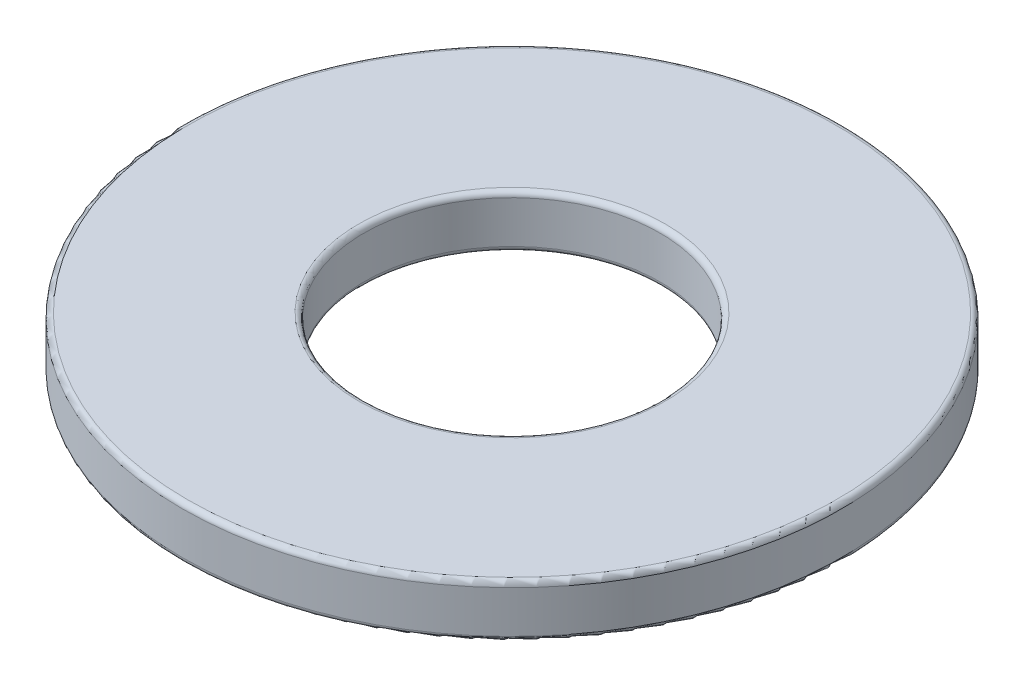
ISO-10303-21;
HEADER;
FILE_DESCRIPTION(('STEP AP214'),'2;1');
FILE_NAME('part.step','',(''),(''),'','','');
FILE_SCHEMA(('AUTOMOTIVE_DESIGN { 1 0 10303 214 1 1 1 1 }'));
ENDSEC;
DATA;
#1=APPLICATION_CONTEXT('core data for automotive mechanical design processes');
#2=APPLICATION_PROTOCOL_DEFINITION('international standard','automotive_design',2000,#1);
#3=PRODUCT_CONTEXT('',#1,'mechanical');
#4=PRODUCT('Part','Part','',(#3));
#5=PRODUCT_RELATED_PRODUCT_CATEGORY('part','',(#4));
#6=PRODUCT_DEFINITION_FORMATION('','',#4);
#7=PRODUCT_DEFINITION_CONTEXT('part definition',#1,'design');
#8=PRODUCT_DEFINITION('design','',#6,#7);
#9=PRODUCT_DEFINITION_SHAPE('','',#8);
#10=(LENGTH_UNIT() NAMED_UNIT(*) SI_UNIT(.MILLI.,.METRE.));
#11=(NAMED_UNIT(*) PLANE_ANGLE_UNIT() SI_UNIT($,.RADIAN.));
#12=(NAMED_UNIT(*) SI_UNIT($,.STERADIAN.) SOLID_ANGLE_UNIT());
#13=UNCERTAINTY_MEASURE_WITH_UNIT(LENGTH_MEASURE(1.E-05),#10,'distance_accuracy_value','');
#14=(GEOMETRIC_REPRESENTATION_CONTEXT(3) GLOBAL_UNCERTAINTY_ASSIGNED_CONTEXT((#13)) GLOBAL_UNIT_ASSIGNED_CONTEXT((#10,
#11,#12)) REPRESENTATION_CONTEXT('',''));
#15=CARTESIAN_POINT('',(0.,0.,0.));
#16=DIRECTION('',(0.,0.,1.));
#17=DIRECTION('',(1.,0.,0.));
#18=AXIS2_PLACEMENT_3D('',#15,#16,#17);
#19=CARTESIAN_POINT('',(0.,1.27,0.));
#20=DIRECTION('',(0.,1.,0.));
#21=DIRECTION('',(0.,0.,1.));
#22=AXIS2_PLACEMENT_3D('',#19,#20,#21);
#23=PLANE('',#22);
#24=CARTESIAN_POINT('',(0.,1.27,0.));
#25=DIRECTION('',(0.,1.,0.));
#26=DIRECTION('',(0.,0.,1.));
#27=AXIS2_PLACEMENT_3D('',#24,#25,#26);
#28=CIRCLE('',#27,3.6957);
#29=CARTESIAN_POINT('',(0.,1.27,3.6957));
#30=VERTEX_POINT('',#29);
#31=EDGE_CURVE('E10',#30,#30,#28,.F.);
#32=ORIENTED_EDGE('',*,*,#31,.T.);
#33=EDGE_LOOP('',(#32));
#34=FACE_BOUND('',#33,.T.);
#35=CARTESIAN_POINT('',(0.,1.27,0.));
#36=DIRECTION('',(0.,1.,0.));
#37=DIRECTION('',(0.,0.,1.));
#38=AXIS2_PLACEMENT_3D('',#35,#36,#37);
#39=CIRCLE('',#38,7.8105);
#40=CARTESIAN_POINT('',(0.,1.27,7.8105));
#41=VERTEX_POINT('',#40);
#42=EDGE_CURVE('E42',#41,#41,#39,.T.);
#43=ORIENTED_EDGE('',*,*,#42,.T.);
#44=EDGE_LOOP('',(#43));
#45=FACE_BOUND('',#44,.T.);
#46=ADVANCED_FACE('F35',(#34,#45),#23,.T.);
#47=CARTESIAN_POINT('',(0.,0.,0.));
#48=DIRECTION('',(0.,1.,0.));
#49=DIRECTION('',(0.,0.,1.));
#50=AXIS2_PLACEMENT_3D('',#47,#48,#49);
#51=PLANE('',#50);
#52=CARTESIAN_POINT('',(0.,0.,0.));
#53=DIRECTION('',(0.,1.,0.));
#54=DIRECTION('',(0.,0.,1.));
#55=AXIS2_PLACEMENT_3D('',#52,#53,#54);
#56=CIRCLE('',#55,3.6957);
#57=CARTESIAN_POINT('',(0.,0.,3.6957));
#58=VERTEX_POINT('',#57);
#59=EDGE_CURVE('E61',#58,#58,#56,.T.);
#60=ORIENTED_EDGE('',*,*,#59,.T.);
#61=EDGE_LOOP('',(#60));
#62=FACE_BOUND('',#61,.T.);
#63=CARTESIAN_POINT('',(0.,0.,0.));
#64=DIRECTION('',(0.,1.,0.));
#65=DIRECTION('',(0.,0.,1.));
#66=AXIS2_PLACEMENT_3D('',#63,#64,#65);
#67=CIRCLE('',#66,7.8105);
#68=CARTESIAN_POINT('',(0.,0.,7.8105));
#69=VERTEX_POINT('',#68);
#70=EDGE_CURVE('E64',#69,#69,#67,.F.);
#71=ORIENTED_EDGE('',*,*,#70,.T.);
#72=EDGE_LOOP('',(#71));
#73=FACE_BOUND('',#72,.T.);
#74=ADVANCED_FACE('F68',(#62,#73),#51,.F.);
#75=CARTESIAN_POINT('',(0.,1.27,0.));
#76=DIRECTION('',(0.,-1.,0.));
#77=DIRECTION('',(0.,0.,-1.));
#78=AXIS2_PLACEMENT_3D('',#75,#76,#77);
#79=CYLINDRICAL_SURFACE('',#78,7.9375);
#80=CARTESIAN_POINT('',(0.,0.127,0.));
#81=DIRECTION('',(0.,1.,0.));
#82=DIRECTION('',(0.,0.,1.));
#83=AXIS2_PLACEMENT_3D('',#80,#81,#82);
#84=CIRCLE('',#83,7.9375);
#85=CARTESIAN_POINT('',(0.,0.127,7.9375));
#86=VERTEX_POINT('',#85);
#87=EDGE_CURVE('E46',#86,#86,#84,.T.);
#88=ORIENTED_EDGE('',*,*,#87,.T.);
#89=EDGE_LOOP('',(#88));
#90=FACE_BOUND('',#89,.T.);
#91=CARTESIAN_POINT('',(0.,1.143,0.));
#92=DIRECTION('',(0.,1.,0.));
#93=DIRECTION('',(0.,0.,1.));
#94=AXIS2_PLACEMENT_3D('',#91,#92,#93);
#95=CIRCLE('',#94,7.9375);
#96=CARTESIAN_POINT('',(0.,1.143,7.9375));
#97=VERTEX_POINT('',#96);
#98=EDGE_CURVE('E50',#97,#97,#95,.F.);
#99=ORIENTED_EDGE('',*,*,#98,.T.);
#100=EDGE_LOOP('',(#99));
#101=FACE_BOUND('',#100,.T.);
#102=ADVANCED_FACE('F78',(#90,#101),#79,.T.);
#103=CARTESIAN_POINT('',(0.,1.27,0.));
#104=DIRECTION('',(0.,-1.,0.));
#105=DIRECTION('',(0.,0.,-1.));
#106=AXIS2_PLACEMENT_3D('',#103,#104,#105);
#107=CYLINDRICAL_SURFACE('',#106,3.5687);
#108=CARTESIAN_POINT('',(0.,0.127,0.));
#109=DIRECTION('',(0.,1.,0.));
#110=DIRECTION('',(0.,0.,1.));
#111=AXIS2_PLACEMENT_3D('',#108,#109,#110);
#112=CIRCLE('',#111,3.5687);
#113=CARTESIAN_POINT('',(0.,0.127,3.5687));
#114=VERTEX_POINT('',#113);
#115=EDGE_CURVE('E55',#114,#114,#112,.F.);
#116=ORIENTED_EDGE('',*,*,#115,.T.);
#117=EDGE_LOOP('',(#116));
#118=FACE_BOUND('',#117,.T.);
#119=CARTESIAN_POINT('',(0.,1.143,0.));
#120=DIRECTION('',(0.,1.,0.));
#121=DIRECTION('',(0.,0.,1.));
#122=AXIS2_PLACEMENT_3D('',#119,#120,#121);
#123=CIRCLE('',#122,3.5687);
#124=CARTESIAN_POINT('',(0.,1.143,3.5687));
#125=VERTEX_POINT('',#124);
#126=EDGE_CURVE('E58',#125,#125,#123,.T.);
#127=ORIENTED_EDGE('',*,*,#126,.T.);
#128=EDGE_LOOP('',(#127));
#129=FACE_BOUND('',#128,.T.);
#130=ADVANCED_FACE('F81',(#118,#129),#107,.F.);
#131=CARTESIAN_POINT('',(0.,0.127,0.));
#132=DIRECTION('',(0.,1.,0.));
#133=DIRECTION('',(0.,0.,1.));
#134=AXIS2_PLACEMENT_3D('',#131,#132,#133);
#135=TOROIDAL_SURFACE('',#134,3.6957,0.127);
#136=ORIENTED_EDGE('',*,*,#115,.F.);
#137=EDGE_LOOP('',(#136));
#138=FACE_BOUND('',#137,.T.);
#139=ORIENTED_EDGE('',*,*,#59,.F.);
#140=EDGE_LOOP('',(#139));
#141=FACE_BOUND('',#140,.T.);
#142=ADVANCED_FACE('F74',(#138,#141),#135,.T.);
#143=CARTESIAN_POINT('',(0.,0.127,0.));
#144=DIRECTION('',(0.,1.,0.));
#145=DIRECTION('',(0.,0.,1.));
#146=AXIS2_PLACEMENT_3D('',#143,#144,#145);
#147=TOROIDAL_SURFACE('',#146,7.8105,0.127);
#148=ORIENTED_EDGE('',*,*,#70,.F.);
#149=EDGE_LOOP('',(#148));
#150=FACE_BOUND('',#149,.T.);
#151=ORIENTED_EDGE('',*,*,#87,.F.);
#152=EDGE_LOOP('',(#151));
#153=FACE_BOUND('',#152,.T.);
#154=ADVANCED_FACE('F70',(#150,#153),#147,.T.);
#155=CARTESIAN_POINT('',(0.,1.143,0.));
#156=DIRECTION('',(0.,1.,0.));
#157=DIRECTION('',(0.,0.,1.));
#158=AXIS2_PLACEMENT_3D('',#155,#156,#157);
#159=TOROIDAL_SURFACE('',#158,3.6957,0.127);
#160=ORIENTED_EDGE('',*,*,#31,.F.);
#161=EDGE_LOOP('',(#160));
#162=FACE_BOUND('',#161,.T.);
#163=ORIENTED_EDGE('',*,*,#126,.F.);
#164=EDGE_LOOP('',(#163));
#165=FACE_BOUND('',#164,.T.);
#166=ADVANCED_FACE('F73',(#162,#165),#159,.T.);
#167=CARTESIAN_POINT('',(0.,1.143,0.));
#168=DIRECTION('',(0.,1.,0.));
#169=DIRECTION('',(0.,0.,1.));
#170=AXIS2_PLACEMENT_3D('',#167,#168,#169);
#171=TOROIDAL_SURFACE('',#170,7.8105,0.127);
#172=ORIENTED_EDGE('',*,*,#98,.F.);
#173=EDGE_LOOP('',(#172));
#174=FACE_BOUND('',#173,.T.);
#175=ORIENTED_EDGE('',*,*,#42,.F.);
#176=EDGE_LOOP('',(#175));
#177=FACE_BOUND('',#176,.T.);
#178=ADVANCED_FACE('F37',(#174,#177),#171,.T.);
#179=CLOSED_SHELL('',(#46,#74,#102,#130,#142,#154,#166,#178));
#180=MANIFOLD_SOLID_BREP('B2',#179);
#181=ADVANCED_BREP_SHAPE_REPRESENTATION('',(#18,#180),#14);
#182=SHAPE_DEFINITION_REPRESENTATION(#9,#181);
ENDSEC;
END-ISO-10303-21;
